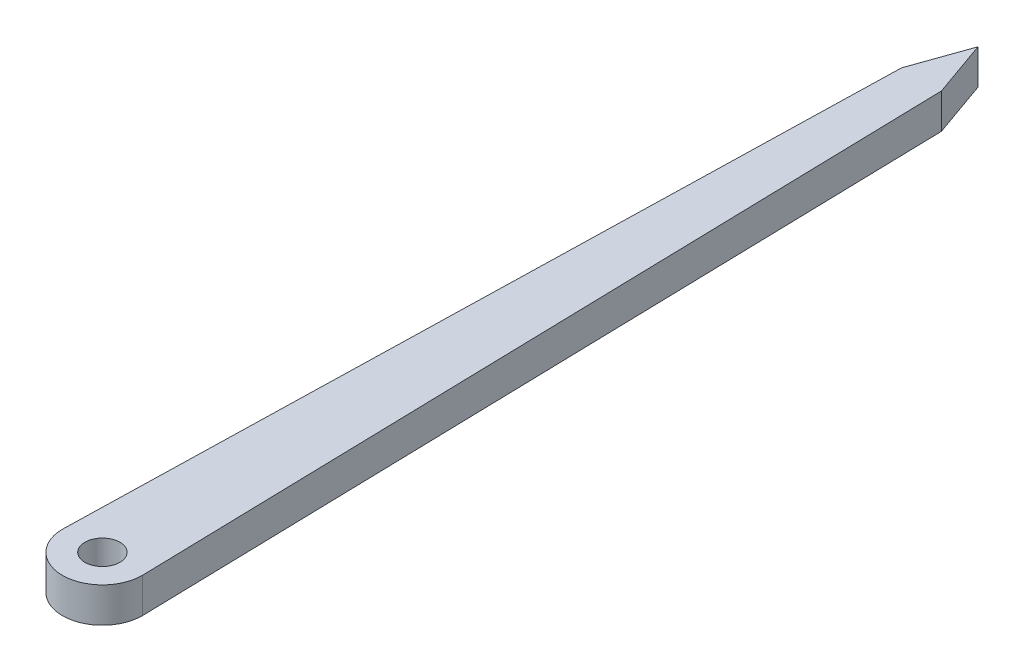
ISO-10303-21;
HEADER;
FILE_DESCRIPTION(('STEP AP214'),'2;1');
FILE_NAME('part.step','',(''),(''),'','','');
FILE_SCHEMA(('AUTOMOTIVE_DESIGN { 1 0 10303 214 1 1 1 1 }'));
ENDSEC;
DATA;
#1=APPLICATION_CONTEXT('core data for automotive mechanical design processes');
#2=APPLICATION_PROTOCOL_DEFINITION('international standard','automotive_design',2000,#1);
#3=PRODUCT_CONTEXT('',#1,'mechanical');
#4=PRODUCT('Part','Part','',(#3));
#5=PRODUCT_RELATED_PRODUCT_CATEGORY('part','',(#4));
#6=PRODUCT_DEFINITION_FORMATION('','',#4);
#7=PRODUCT_DEFINITION_CONTEXT('part definition',#1,'design');
#8=PRODUCT_DEFINITION('design','',#6,#7);
#9=PRODUCT_DEFINITION_SHAPE('','',#8);
#10=(LENGTH_UNIT() NAMED_UNIT(*) SI_UNIT(.MILLI.,.METRE.));
#11=(NAMED_UNIT(*) PLANE_ANGLE_UNIT() SI_UNIT($,.RADIAN.));
#12=(NAMED_UNIT(*) SI_UNIT($,.STERADIAN.) SOLID_ANGLE_UNIT());
#13=UNCERTAINTY_MEASURE_WITH_UNIT(LENGTH_MEASURE(1.E-05),#10,'distance_accuracy_value','');
#14=(GEOMETRIC_REPRESENTATION_CONTEXT(3) GLOBAL_UNCERTAINTY_ASSIGNED_CONTEXT((#13)) GLOBAL_UNIT_ASSIGNED_CONTEXT((#10,
#11,#12)) REPRESENTATION_CONTEXT('',''));
#15=CARTESIAN_POINT('',(0.,0.,0.));
#16=DIRECTION('',(0.,0.,1.));
#17=DIRECTION('',(1.,0.,0.));
#18=AXIS2_PLACEMENT_3D('',#15,#16,#17);
#19=CARTESIAN_POINT('',(-3.99762187871581,3.5,-0.0975029726516047));
#20=DIRECTION('',(-0.99970269064305,0.,-0.0243829924547084));
#21=DIRECTION('',(-0.0243829924547084,0.,0.99970269064305));
#22=AXIS2_PLACEMENT_3D('',#19,#20,#21);
#23=PLANE('',#22);
#24=DIRECTION('',(0.0243829924547084,0.,-0.99970269064305));
#25=VECTOR('',#24,1.);
#26=CARTESIAN_POINT('',(-3.99762187871581,0.,-0.0975029726516047));
#27=LINE('',#26,#25);
#28=CARTESIAN_POINT('',(-4.,0.,0.));
#29=VERTEX_POINT('',#28);
#30=CARTESIAN_POINT('',(-2.00000000000001,0.,-82.));
#31=VERTEX_POINT('',#30);
#32=EDGE_CURVE('E112',#29,#31,#27,.T.);
#33=ORIENTED_EDGE('',*,*,#32,.F.);
#34=DIRECTION('',(0.,-1.,0.));
#35=VECTOR('',#34,1.);
#36=CARTESIAN_POINT('',(-4.,3.5,0.));
#37=LINE('',#36,#35);
#38=CARTESIAN_POINT('',(-4.,3.5,0.));
#39=VERTEX_POINT('',#38);
#40=EDGE_CURVE('E11',#39,#29,#37,.T.);
#41=ORIENTED_EDGE('',*,*,#40,.F.);
#42=DIRECTION('',(0.0243829924547084,0.,-0.99970269064305));
#43=VECTOR('',#42,1.);
#44=CARTESIAN_POINT('',(-3.99762187871581,3.5,-0.0975029726516047));
#45=LINE('',#44,#43);
#46=CARTESIAN_POINT('',(-2.00000000000001,3.5,-82.));
#47=VERTEX_POINT('',#46);
#48=EDGE_CURVE('E126',#39,#47,#45,.T.);
#49=ORIENTED_EDGE('',*,*,#48,.T.);
#50=DIRECTION('',(0.,-1.,0.));
#51=VECTOR('',#50,1.);
#52=CARTESIAN_POINT('',(-2.00000000000001,3.5,-82.));
#53=LINE('',#52,#51);
#54=EDGE_CURVE('E51',#47,#31,#53,.T.);
#55=ORIENTED_EDGE('',*,*,#54,.T.);
#56=EDGE_LOOP('',(#33,#41,#49,#55));
#57=FACE_BOUND('',#56,.T.);
#58=ADVANCED_FACE('F35',(#57),#23,.T.);
#59=CARTESIAN_POINT('',(0.,3.5,0.));
#60=DIRECTION('',(0.,-1.,0.));
#61=DIRECTION('',(0.,0.,-1.));
#62=AXIS2_PLACEMENT_3D('',#59,#60,#61);
#63=CYLINDRICAL_SURFACE('',#62,4.);
#64=CARTESIAN_POINT('',(0.,0.,0.));
#65=DIRECTION('',(0.,1.,0.));
#66=DIRECTION('',(0.,0.,1.));
#67=AXIS2_PLACEMENT_3D('',#64,#65,#66);
#68=CIRCLE('',#67,4.);
#69=CARTESIAN_POINT('',(4.,0.,0.));
#70=VERTEX_POINT('',#69);
#71=EDGE_CURVE('E114',#29,#70,#68,.T.);
#72=ORIENTED_EDGE('',*,*,#71,.T.);
#73=DIRECTION('',(0.,-1.,0.));
#74=VECTOR('',#73,1.);
#75=CARTESIAN_POINT('',(4.,3.5,0.));
#76=LINE('',#75,#74);
#77=CARTESIAN_POINT('',(4.,3.5,0.));
#78=VERTEX_POINT('',#77);
#79=EDGE_CURVE('E43',#78,#70,#76,.T.);
#80=ORIENTED_EDGE('',*,*,#79,.F.);
#81=CARTESIAN_POINT('',(0.,3.5,0.));
#82=DIRECTION('',(0.,1.,0.));
#83=DIRECTION('',(0.,0.,1.));
#84=AXIS2_PLACEMENT_3D('',#81,#82,#83);
#85=CIRCLE('',#84,4.);
#86=EDGE_CURVE('E100',#39,#78,#85,.T.);
#87=ORIENTED_EDGE('',*,*,#86,.F.);
#88=ORIENTED_EDGE('',*,*,#40,.T.);
#89=EDGE_LOOP('',(#72,#80,#87,#88));
#90=FACE_BOUND('',#89,.T.);
#91=ADVANCED_FACE('F130',(#90),#63,.T.);
#92=CARTESIAN_POINT('',(3.99762187871581,3.5,-0.0975029726516057));
#93=DIRECTION('',(0.99970269064305,0.,-0.0243829924547086));
#94=DIRECTION('',(-0.0243829924547086,0.,-0.99970269064305));
#95=AXIS2_PLACEMENT_3D('',#92,#93,#94);
#96=PLANE('',#95);
#97=DIRECTION('',(0.0243829924547087,0.,0.99970269064305));
#98=VECTOR('',#97,1.);
#99=CARTESIAN_POINT('',(3.99762187871581,0.,-0.0975029726516057));
#100=LINE('',#99,#98);
#101=CARTESIAN_POINT('',(1.99999999999998,0.,-82.));
#102=VERTEX_POINT('',#101);
#103=EDGE_CURVE('E88',#102,#70,#100,.T.);
#104=ORIENTED_EDGE('',*,*,#103,.F.);
#105=DIRECTION('',(0.,-1.,0.));
#106=VECTOR('',#105,1.);
#107=CARTESIAN_POINT('',(1.99999999999998,3.5,-82.));
#108=LINE('',#107,#106);
#109=CARTESIAN_POINT('',(1.99999999999998,3.5,-82.));
#110=VERTEX_POINT('',#109);
#111=EDGE_CURVE('E83',#110,#102,#108,.T.);
#112=ORIENTED_EDGE('',*,*,#111,.F.);
#113=DIRECTION('',(0.0243829924547087,0.,0.99970269064305));
#114=VECTOR('',#113,1.);
#115=CARTESIAN_POINT('',(3.99762187871581,3.5,-0.0975029726516057));
#116=LINE('',#115,#114);
#117=EDGE_CURVE('E86',#110,#78,#116,.T.);
#118=ORIENTED_EDGE('',*,*,#117,.T.);
#119=ORIENTED_EDGE('',*,*,#79,.T.);
#120=EDGE_LOOP('',(#104,#112,#118,#119));
#121=FACE_BOUND('',#120,.T.);
#122=ADVANCED_FACE('F85',(#121),#96,.T.);
#123=CARTESIAN_POINT('',(27.5478915810209,3.5,-9.73965047216584));
#124=DIRECTION('',(0.942809041582063,0.,-0.333333333333334));
#125=DIRECTION('',(-0.333333333333334,0.,-0.942809041582063));
#126=AXIS2_PLACEMENT_3D('',#123,#124,#125);
#127=PLANE('',#126);
#128=DIRECTION('',(0.333333333333334,0.,0.942809041582063));
#129=VECTOR('',#128,1.);
#130=CARTESIAN_POINT('',(27.5478915810209,0.,-9.73965047216584));
#131=LINE('',#130,#129);
#132=CARTESIAN_POINT('',(0.,0.,-87.6568542494924));
#133=VERTEX_POINT('',#132);
#134=EDGE_CURVE('E118',#133,#102,#131,.T.);
#135=ORIENTED_EDGE('',*,*,#134,.F.);
#136=DIRECTION('',(0.,-1.,0.));
#137=VECTOR('',#136,1.);
#138=CARTESIAN_POINT('',(0.,3.5,-87.6568542494924));
#139=LINE('',#138,#137);
#140=CARTESIAN_POINT('',(0.,3.5,-87.6568542494924));
#141=VERTEX_POINT('',#140);
#142=EDGE_CURVE('E67',#141,#133,#139,.T.);
#143=ORIENTED_EDGE('',*,*,#142,.F.);
#144=DIRECTION('',(0.333333333333334,0.,0.942809041582063));
#145=VECTOR('',#144,1.);
#146=CARTESIAN_POINT('',(27.5478915810209,3.5,-9.73965047216584));
#147=LINE('',#146,#145);
#148=EDGE_CURVE('E99',#141,#110,#147,.T.);
#149=ORIENTED_EDGE('',*,*,#148,.T.);
#150=ORIENTED_EDGE('',*,*,#111,.T.);
#151=EDGE_LOOP('',(#135,#143,#149,#150));
#152=FACE_BOUND('',#151,.T.);
#153=ADVANCED_FACE('F103',(#152),#127,.T.);
#154=CARTESIAN_POINT('',(-27.5478915810209,3.5,-9.73965047216583));
#155=DIRECTION('',(-0.942809041582063,0.,-0.333333333333333));
#156=DIRECTION('',(-0.333333333333333,0.,0.942809041582063));
#157=AXIS2_PLACEMENT_3D('',#154,#155,#156);
#158=PLANE('',#157);
#159=DIRECTION('',(0.333333333333333,0.,-0.942809041582063));
#160=VECTOR('',#159,1.);
#161=CARTESIAN_POINT('',(-27.5478915810209,0.,-9.73965047216583));
#162=LINE('',#161,#160);
#163=EDGE_CURVE('E120',#31,#133,#162,.T.);
#164=ORIENTED_EDGE('',*,*,#163,.F.);
#165=ORIENTED_EDGE('',*,*,#54,.F.);
#166=DIRECTION('',(0.333333333333333,0.,-0.942809041582063));
#167=VECTOR('',#166,1.);
#168=CARTESIAN_POINT('',(-27.5478915810209,3.5,-9.73965047216583));
#169=LINE('',#168,#167);
#170=EDGE_CURVE('E104',#47,#141,#169,.T.);
#171=ORIENTED_EDGE('',*,*,#170,.T.);
#172=ORIENTED_EDGE('',*,*,#142,.T.);
#173=EDGE_LOOP('',(#164,#165,#171,#172));
#174=FACE_BOUND('',#173,.T.);
#175=ADVANCED_FACE('F134',(#174),#158,.T.);
#176=CARTESIAN_POINT('',(0.,3.5,0.));
#177=DIRECTION('',(0.,-1.,0.));
#178=DIRECTION('',(0.,0.,-1.));
#179=AXIS2_PLACEMENT_3D('',#176,#177,#178);
#180=CYLINDRICAL_SURFACE('',#179,1.75);
#181=CARTESIAN_POINT('',(0.,3.5,0.));
#182=DIRECTION('',(0.,1.,0.));
#183=DIRECTION('',(0.,0.,1.));
#184=AXIS2_PLACEMENT_3D('',#181,#182,#183);
#185=CIRCLE('',#184,1.75);
#186=CARTESIAN_POINT('',(0.,3.5,1.75));
#187=VERTEX_POINT('',#186);
#188=EDGE_CURVE('E106',#187,#187,#185,.T.);
#189=ORIENTED_EDGE('',*,*,#188,.T.);
#190=EDGE_LOOP('',(#189));
#191=FACE_BOUND('',#190,.T.);
#192=CARTESIAN_POINT('',(0.,0.,0.));
#193=DIRECTION('',(0.,1.,0.));
#194=DIRECTION('',(0.,0.,1.));
#195=AXIS2_PLACEMENT_3D('',#192,#193,#194);
#196=CIRCLE('',#195,1.75);
#197=CARTESIAN_POINT('',(0.,0.,1.75));
#198=VERTEX_POINT('',#197);
#199=EDGE_CURVE('E123',#198,#198,#196,.T.);
#200=ORIENTED_EDGE('',*,*,#199,.F.);
#201=EDGE_LOOP('',(#200));
#202=FACE_BOUND('',#201,.T.);
#203=ADVANCED_FACE('F136',(#191,#202),#180,.F.);
#204=CARTESIAN_POINT('',(0.,3.5,0.));
#205=DIRECTION('',(0.,1.,0.));
#206=DIRECTION('',(0.,0.,1.));
#207=AXIS2_PLACEMENT_3D('',#204,#205,#206);
#208=PLANE('',#207);
#209=ORIENTED_EDGE('',*,*,#48,.F.);
#210=ORIENTED_EDGE('',*,*,#86,.T.);
#211=ORIENTED_EDGE('',*,*,#117,.F.);
#212=ORIENTED_EDGE('',*,*,#148,.F.);
#213=ORIENTED_EDGE('',*,*,#170,.F.);
#214=EDGE_LOOP('',(#209,#210,#211,#212,#213));
#215=FACE_BOUND('',#214,.T.);
#216=ORIENTED_EDGE('',*,*,#188,.F.);
#217=EDGE_LOOP('',(#216));
#218=FACE_BOUND('',#217,.T.);
#219=ADVANCED_FACE('F96',(#215,#218),#208,.T.);
#220=CARTESIAN_POINT('',(0.,0.,0.));
#221=DIRECTION('',(0.,1.,0.));
#222=DIRECTION('',(0.,0.,1.));
#223=AXIS2_PLACEMENT_3D('',#220,#221,#222);
#224=PLANE('',#223);
#225=ORIENTED_EDGE('',*,*,#32,.T.);
#226=ORIENTED_EDGE('',*,*,#163,.T.);
#227=ORIENTED_EDGE('',*,*,#134,.T.);
#228=ORIENTED_EDGE('',*,*,#103,.T.);
#229=ORIENTED_EDGE('',*,*,#71,.F.);
#230=EDGE_LOOP('',(#225,#226,#227,#228,#229));
#231=FACE_BOUND('',#230,.T.);
#232=ORIENTED_EDGE('',*,*,#199,.T.);
#233=EDGE_LOOP('',(#232));
#234=FACE_BOUND('',#233,.T.);
#235=ADVANCED_FACE('F132',(#231,#234),#224,.F.);
#236=CLOSED_SHELL('',(#58,#91,#122,#153,#175,#203,#219,#235));
#237=MANIFOLD_SOLID_BREP('B2',#236);
#238=ADVANCED_BREP_SHAPE_REPRESENTATION('',(#18,#237),#14);
#239=SHAPE_DEFINITION_REPRESENTATION(#9,#238);
ENDSEC;
END-ISO-10303-21;
